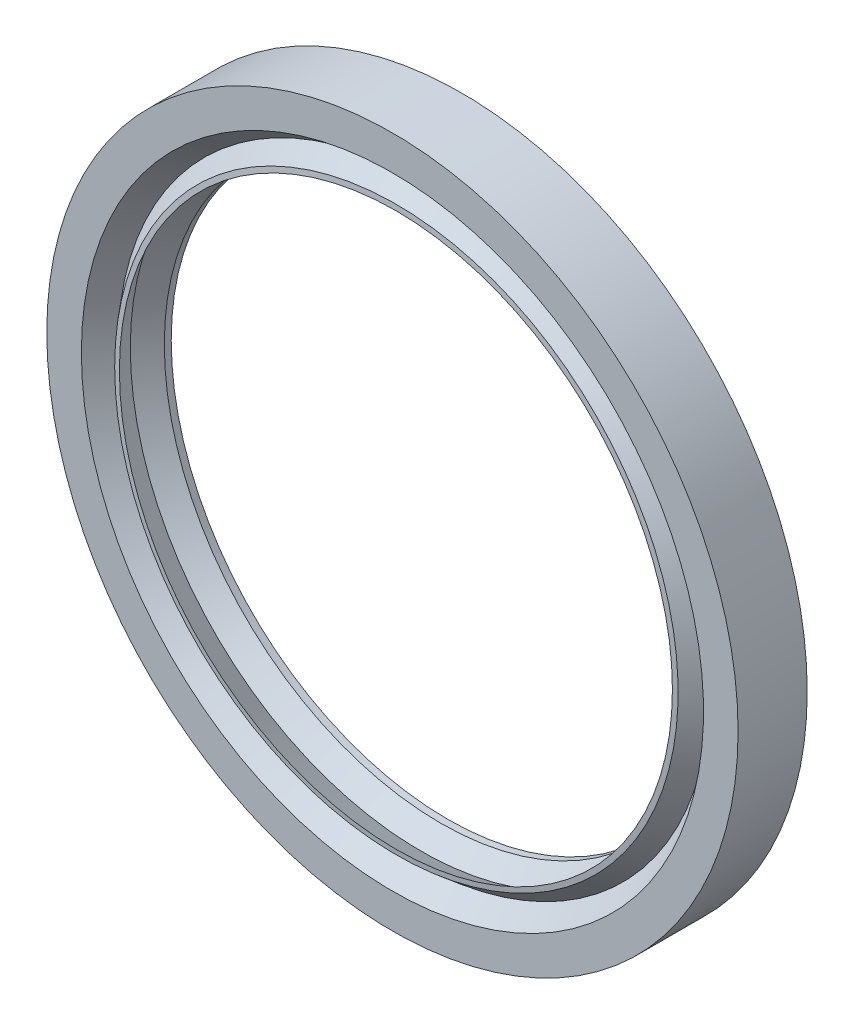
ISO-10303-21;
HEADER;
FILE_DESCRIPTION(('STEP AP214'),'2;1');
FILE_NAME('part.step','',(''),(''),'','','');
FILE_SCHEMA(('AUTOMOTIVE_DESIGN { 1 0 10303 214 1 1 1 1 }'));
ENDSEC;
DATA;
#1=APPLICATION_CONTEXT('core data for automotive mechanical design processes');
#2=APPLICATION_PROTOCOL_DEFINITION('international standard','automotive_design',2000,#1);
#3=PRODUCT_CONTEXT('',#1,'mechanical');
#4=PRODUCT('Part','Part','',(#3));
#5=PRODUCT_RELATED_PRODUCT_CATEGORY('part','',(#4));
#6=PRODUCT_DEFINITION_FORMATION('','',#4);
#7=PRODUCT_DEFINITION_CONTEXT('part definition',#1,'design');
#8=PRODUCT_DEFINITION('design','',#6,#7);
#9=PRODUCT_DEFINITION_SHAPE('','',#8);
#10=(LENGTH_UNIT() NAMED_UNIT(*) SI_UNIT(.MILLI.,.METRE.));
#11=(NAMED_UNIT(*) PLANE_ANGLE_UNIT() SI_UNIT($,.RADIAN.));
#12=(NAMED_UNIT(*) SI_UNIT($,.STERADIAN.) SOLID_ANGLE_UNIT());
#13=UNCERTAINTY_MEASURE_WITH_UNIT(LENGTH_MEASURE(1.E-05),#10,'distance_accuracy_value','');
#14=(GEOMETRIC_REPRESENTATION_CONTEXT(3) GLOBAL_UNCERTAINTY_ASSIGNED_CONTEXT((#13)) GLOBAL_UNIT_ASSIGNED_CONTEXT((#10,
#11,#12)) REPRESENTATION_CONTEXT('',''));
#15=CARTESIAN_POINT('',(0.,0.,0.));
#16=DIRECTION('',(0.,0.,1.));
#17=DIRECTION('',(1.,0.,0.));
#18=AXIS2_PLACEMENT_3D('',#15,#16,#17);
#19=CARTESIAN_POINT('',(0.,48.,-10.));
#20=DIRECTION('',(0.,0.,-1.));
#21=DIRECTION('',(-1.,0.,0.));
#22=AXIS2_PLACEMENT_3D('',#19,#20,#21);
#23=PLANE('',#22);
#24=CARTESIAN_POINT('',(0.,0.,-10.));
#25=DIRECTION('',(0.,0.,-1.));
#26=DIRECTION('',(-1.,0.,0.));
#27=AXIS2_PLACEMENT_3D('',#24,#25,#26);
#28=CIRCLE('',#27,50.);
#29=CARTESIAN_POINT('',(-50.,0.,-10.));
#30=VERTEX_POINT('',#29);
#31=EDGE_CURVE('E10',#30,#30,#28,.T.);
#32=ORIENTED_EDGE('',*,*,#31,.T.);
#33=EDGE_LOOP('',(#32));
#34=FACE_BOUND('',#33,.T.);
#35=CARTESIAN_POINT('',(0.,0.,-10.));
#36=DIRECTION('',(0.,0.,-1.));
#37=DIRECTION('',(-1.,0.,0.));
#38=AXIS2_PLACEMENT_3D('',#35,#36,#37);
#39=CIRCLE('',#38,48.);
#40=CARTESIAN_POINT('',(-48.,0.,-10.));
#41=VERTEX_POINT('',#40);
#42=EDGE_CURVE('E70',#41,#41,#39,.T.);
#43=ORIENTED_EDGE('',*,*,#42,.F.);
#44=EDGE_LOOP('',(#43));
#45=FACE_BOUND('',#44,.T.);
#46=ADVANCED_FACE('F30',(#34,#45),#23,.T.);
#47=CARTESIAN_POINT('',(0.,0.,0.));
#48=DIRECTION('',(0.,0.,-1.));
#49=DIRECTION('',(-1.,0.,0.));
#50=AXIS2_PLACEMENT_3D('',#47,#48,#49);
#51=CYLINDRICAL_SURFACE('',#50,50.);
#52=CARTESIAN_POINT('',(0.,0.,0.));
#53=DIRECTION('',(0.,0.,-1.));
#54=DIRECTION('',(-1.,0.,0.));
#55=AXIS2_PLACEMENT_3D('',#52,#53,#54);
#56=CIRCLE('',#55,50.);
#57=CARTESIAN_POINT('',(-50.,0.,0.));
#58=VERTEX_POINT('',#57);
#59=EDGE_CURVE('E36',#58,#58,#56,.T.);
#60=ORIENTED_EDGE('',*,*,#59,.T.);
#61=EDGE_LOOP('',(#60));
#62=FACE_BOUND('',#61,.T.);
#63=ORIENTED_EDGE('',*,*,#31,.F.);
#64=EDGE_LOOP('',(#63));
#65=FACE_BOUND('',#64,.T.);
#66=ADVANCED_FACE('F78',(#62,#65),#51,.T.);
#67=CARTESIAN_POINT('',(0.,50.,0.));
#68=DIRECTION('',(0.,0.,1.));
#69=DIRECTION('',(1.,0.,0.));
#70=AXIS2_PLACEMENT_3D('',#67,#68,#69);
#71=PLANE('',#70);
#72=CARTESIAN_POINT('',(0.,0.,0.));
#73=DIRECTION('',(0.,0.,-1.));
#74=DIRECTION('',(-1.,0.,0.));
#75=AXIS2_PLACEMENT_3D('',#72,#73,#74);
#76=CIRCLE('',#75,45.);
#77=CARTESIAN_POINT('',(-45.,0.,0.));
#78=VERTEX_POINT('',#77);
#79=EDGE_CURVE('E40',#78,#78,#76,.T.);
#80=ORIENTED_EDGE('',*,*,#79,.T.);
#81=EDGE_LOOP('',(#80));
#82=FACE_BOUND('',#81,.T.);
#83=ORIENTED_EDGE('',*,*,#59,.F.);
#84=EDGE_LOOP('',(#83));
#85=FACE_BOUND('',#84,.T.);
#86=ADVANCED_FACE('F82',(#82,#85),#71,.T.);
#87=CARTESIAN_POINT('',(0.,0.,0.));
#88=DIRECTION('',(0.,0.,1.));
#89=DIRECTION('',(1.,0.,0.));
#90=AXIS2_PLACEMENT_3D('',#87,#88,#89);
#91=CONICAL_SURFACE('',#90,45.,0.620249485982821);
#92=CARTESIAN_POINT('',(0.,0.,-3.06905045884929));
#93=DIRECTION('',(0.,0.,-1.));
#94=DIRECTION('',(-1.,0.,0.));
#95=AXIS2_PLACEMENT_3D('',#92,#93,#94);
#96=CIRCLE('',#95,42.8078211008219);
#97=CARTESIAN_POINT('',(-42.8078211008219,0.,-3.06905045884929));
#98=VERTEX_POINT('',#97);
#99=EDGE_CURVE('E44',#98,#98,#96,.T.);
#100=ORIENTED_EDGE('',*,*,#99,.T.);
#101=EDGE_LOOP('',(#100));
#102=FACE_BOUND('',#101,.T.);
#103=ORIENTED_EDGE('',*,*,#79,.F.);
#104=EDGE_LOOP('',(#103));
#105=FACE_BOUND('',#104,.T.);
#106=ADVANCED_FACE('F86',(#102,#105),#91,.F.);
#107=CARTESIAN_POINT('',(0.,0.,-3.06905045884929));
#108=DIRECTION('',(0.,0.,-1.));
#109=DIRECTION('',(-1.,0.,0.));
#110=AXIS2_PLACEMENT_3D('',#107,#108,#109);
#111=CONICAL_SURFACE('',#110,42.8078211008219,0.688747453012915);
#112=CARTESIAN_POINT('',(0.,0.,-0.573004994056335));
#113=DIRECTION('',(0.,0.,-1.));
#114=DIRECTION('',(-1.,0.,0.));
#115=AXIS2_PLACEMENT_3D('',#112,#113,#114);
#116=CIRCLE('',#115,40.7529952972062);
#117=CARTESIAN_POINT('',(-40.7529952972062,0.,-0.573004994056335));
#118=VERTEX_POINT('',#117);
#119=EDGE_CURVE('E49',#118,#118,#116,.T.);
#120=ORIENTED_EDGE('',*,*,#119,.T.);
#121=EDGE_LOOP('',(#120));
#122=FACE_BOUND('',#121,.T.);
#123=ORIENTED_EDGE('',*,*,#99,.F.);
#124=EDGE_LOOP('',(#123));
#125=FACE_BOUND('',#124,.T.);
#126=ADVANCED_FACE('F93',(#122,#125),#111,.T.);
#127=CARTESIAN_POINT('',(0.,0.,-0.573004994056335));
#128=DIRECTION('',(0.,0.,-1.));
#129=DIRECTION('',(-1.,0.,0.));
#130=AXIS2_PLACEMENT_3D('',#127,#128,#129);
#131=CONICAL_SURFACE('',#130,40.7529952972062,1.47414561641036);
#132=CARTESIAN_POINT('',(0.,0.,-0.500000000000001));
#133=DIRECTION('',(0.,0.,-1.));
#134=DIRECTION('',(-1.,0.,0.));
#135=AXIS2_PLACEMENT_3D('',#132,#133,#134);
#136=CIRCLE('',#135,40.);
#137=CARTESIAN_POINT('',(-40.,0.,-0.500000000000001));
#138=VERTEX_POINT('',#137);
#139=EDGE_CURVE('E52',#138,#138,#136,.T.);
#140=ORIENTED_EDGE('',*,*,#139,.T.);
#141=EDGE_LOOP('',(#140));
#142=FACE_BOUND('',#141,.T.);
#143=ORIENTED_EDGE('',*,*,#119,.F.);
#144=EDGE_LOOP('',(#143));
#145=FACE_BOUND('',#144,.T.);
#146=ADVANCED_FACE('F97',(#142,#145),#131,.T.);
#147=CARTESIAN_POINT('',(0.,0.,-0.500000000000001));
#148=DIRECTION('',(0.,0.,-1.));
#149=DIRECTION('',(-1.,0.,0.));
#150=AXIS2_PLACEMENT_3D('',#147,#148,#149);
#151=CONICAL_SURFACE('',#150,40.,0.514214527813489);
#152=CARTESIAN_POINT('',(0.,0.,-4.12952692203059));
#153=DIRECTION('',(0.,0.,-1.));
#154=DIRECTION('',(-1.,0.,0.));
#155=AXIS2_PLACEMENT_3D('',#152,#153,#154);
#156=CIRCLE('',#155,42.0503379128353);
#157=CARTESIAN_POINT('',(-42.0503379128353,0.,-4.12952692203059));
#158=VERTEX_POINT('',#157);
#159=EDGE_CURVE('E55',#158,#158,#156,.T.);
#160=ORIENTED_EDGE('',*,*,#159,.T.);
#161=EDGE_LOOP('',(#160));
#162=FACE_BOUND('',#161,.T.);
#163=ORIENTED_EDGE('',*,*,#139,.F.);
#164=EDGE_LOOP('',(#163));
#165=FACE_BOUND('',#164,.T.);
#166=ADVANCED_FACE('F101',(#162,#165),#151,.F.);
#167=CARTESIAN_POINT('',(0.,0.,-4.12952692203059));
#168=DIRECTION('',(0.,0.,1.));
#169=DIRECTION('',(1.,0.,0.));
#170=AXIS2_PLACEMENT_3D('',#167,#168,#169);
#171=CONICAL_SURFACE('',#170,42.0503379128353,0.620249485982822);
#172=CARTESIAN_POINT('',(0.,0.,-7.));
#173=DIRECTION('',(0.,0.,-1.));
#174=DIRECTION('',(-1.,0.,0.));
#175=AXIS2_PLACEMENT_3D('',#172,#173,#174);
#176=CIRCLE('',#175,40.);
#177=CARTESIAN_POINT('',(-40.,0.,-7.));
#178=VERTEX_POINT('',#177);
#179=EDGE_CURVE('E58',#178,#178,#176,.T.);
#180=ORIENTED_EDGE('',*,*,#179,.T.);
#181=EDGE_LOOP('',(#180));
#182=FACE_BOUND('',#181,.T.);
#183=ORIENTED_EDGE('',*,*,#159,.F.);
#184=EDGE_LOOP('',(#183));
#185=FACE_BOUND('',#184,.T.);
#186=ADVANCED_FACE('F105',(#182,#185),#171,.F.);
#187=CARTESIAN_POINT('',(0.,0.,0.));
#188=DIRECTION('',(0.,0.,-1.));
#189=DIRECTION('',(-1.,0.,0.));
#190=AXIS2_PLACEMENT_3D('',#187,#188,#189);
#191=CYLINDRICAL_SURFACE('',#190,40.);
#192=CARTESIAN_POINT('',(0.,0.,-8.));
#193=DIRECTION('',(0.,0.,-1.));
#194=DIRECTION('',(-1.,0.,0.));
#195=AXIS2_PLACEMENT_3D('',#192,#193,#194);
#196=CIRCLE('',#195,40.);
#197=CARTESIAN_POINT('',(-40.,0.,-8.));
#198=VERTEX_POINT('',#197);
#199=EDGE_CURVE('E61',#198,#198,#196,.T.);
#200=ORIENTED_EDGE('',*,*,#199,.T.);
#201=EDGE_LOOP('',(#200));
#202=FACE_BOUND('',#201,.T.);
#203=ORIENTED_EDGE('',*,*,#179,.F.);
#204=EDGE_LOOP('',(#203));
#205=FACE_BOUND('',#204,.T.);
#206=ADVANCED_FACE('F109',(#202,#205),#191,.F.);
#207=CARTESIAN_POINT('',(0.,0.,-8.));
#208=DIRECTION('',(0.,0.,1.));
#209=DIRECTION('',(1.,0.,0.));
#210=AXIS2_PLACEMENT_3D('',#207,#208,#209);
#211=CONICAL_SURFACE('',#210,40.,0.785398163397448);
#212=CARTESIAN_POINT('',(0.,0.,-2.));
#213=DIRECTION('',(0.,0.,-1.));
#214=DIRECTION('',(-1.,0.,0.));
#215=AXIS2_PLACEMENT_3D('',#212,#213,#214);
#216=CIRCLE('',#215,46.);
#217=CARTESIAN_POINT('',(-46.,0.,-2.));
#218=VERTEX_POINT('',#217);
#219=EDGE_CURVE('E64',#218,#218,#216,.T.);
#220=ORIENTED_EDGE('',*,*,#219,.T.);
#221=EDGE_LOOP('',(#220));
#222=FACE_BOUND('',#221,.T.);
#223=ORIENTED_EDGE('',*,*,#199,.F.);
#224=EDGE_LOOP('',(#223));
#225=FACE_BOUND('',#224,.T.);
#226=ADVANCED_FACE('F113',(#222,#225),#211,.T.);
#227=CARTESIAN_POINT('',(0.,46.,-2.));
#228=DIRECTION('',(0.,0.,-1.));
#229=DIRECTION('',(-1.,0.,0.));
#230=AXIS2_PLACEMENT_3D('',#227,#228,#229);
#231=PLANE('',#230);
#232=CARTESIAN_POINT('',(0.,0.,-2.));
#233=DIRECTION('',(0.,0.,-1.));
#234=DIRECTION('',(-1.,0.,0.));
#235=AXIS2_PLACEMENT_3D('',#232,#233,#234);
#236=CIRCLE('',#235,48.);
#237=CARTESIAN_POINT('',(-48.,0.,-2.));
#238=VERTEX_POINT('',#237);
#239=EDGE_CURVE('E67',#238,#238,#236,.T.);
#240=ORIENTED_EDGE('',*,*,#239,.T.);
#241=EDGE_LOOP('',(#240));
#242=FACE_BOUND('',#241,.T.);
#243=ORIENTED_EDGE('',*,*,#219,.F.);
#244=EDGE_LOOP('',(#243));
#245=FACE_BOUND('',#244,.T.);
#246=ADVANCED_FACE('F117',(#242,#245),#231,.T.);
#247=CARTESIAN_POINT('',(0.,0.,0.));
#248=DIRECTION('',(0.,0.,-1.));
#249=DIRECTION('',(-1.,0.,0.));
#250=AXIS2_PLACEMENT_3D('',#247,#248,#249);
#251=CYLINDRICAL_SURFACE('',#250,48.);
#252=ORIENTED_EDGE('',*,*,#42,.T.);
#253=EDGE_LOOP('',(#252));
#254=FACE_BOUND('',#253,.T.);
#255=ORIENTED_EDGE('',*,*,#239,.F.);
#256=EDGE_LOOP('',(#255));
#257=FACE_BOUND('',#256,.T.);
#258=ADVANCED_FACE('F74',(#254,#257),#251,.F.);
#259=CLOSED_SHELL('',(#46,#66,#86,#106,#126,#146,#166,#186,#206,#226,#246,#258));
#260=MANIFOLD_SOLID_BREP('B2',#259);
#261=ADVANCED_BREP_SHAPE_REPRESENTATION('',(#18,#260),#14);
#262=SHAPE_DEFINITION_REPRESENTATION(#9,#261);
ENDSEC;
END-ISO-10303-21;
